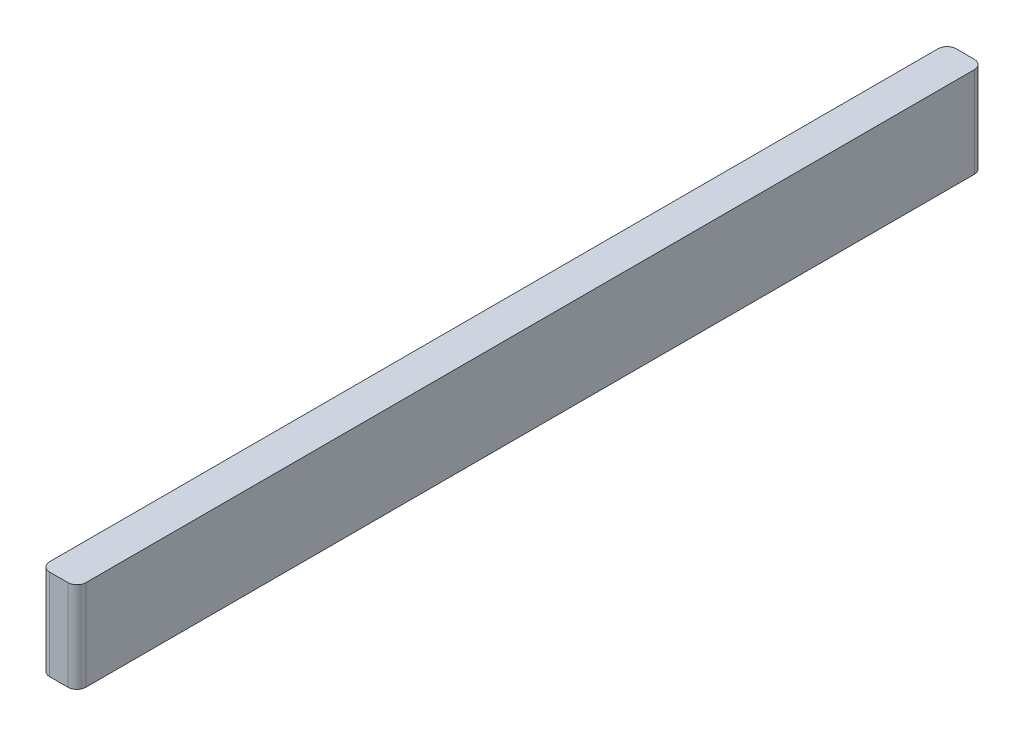
ISO-10303-21;
HEADER;
FILE_DESCRIPTION(('STEP AP214'),'2;1');
FILE_NAME('part.step','',(''),(''),'','','');
FILE_SCHEMA(('AUTOMOTIVE_DESIGN { 1 0 10303 214 1 1 1 1 }'));
ENDSEC;
DATA;
#1=APPLICATION_CONTEXT('core data for automotive mechanical design processes');
#2=APPLICATION_PROTOCOL_DEFINITION('international standard','automotive_design',2000,#1);
#3=PRODUCT_CONTEXT('',#1,'mechanical');
#4=PRODUCT('Part','Part','',(#3));
#5=PRODUCT_RELATED_PRODUCT_CATEGORY('part','',(#4));
#6=PRODUCT_DEFINITION_FORMATION('','',#4);
#7=PRODUCT_DEFINITION_CONTEXT('part definition',#1,'design');
#8=PRODUCT_DEFINITION('design','',#6,#7);
#9=PRODUCT_DEFINITION_SHAPE('','',#8);
#10=(LENGTH_UNIT() NAMED_UNIT(*) SI_UNIT(.MILLI.,.METRE.));
#11=(NAMED_UNIT(*) PLANE_ANGLE_UNIT() SI_UNIT($,.RADIAN.));
#12=(NAMED_UNIT(*) SI_UNIT($,.STERADIAN.) SOLID_ANGLE_UNIT());
#13=UNCERTAINTY_MEASURE_WITH_UNIT(LENGTH_MEASURE(1.E-05),#10,'distance_accuracy_value','');
#14=(GEOMETRIC_REPRESENTATION_CONTEXT(3) GLOBAL_UNCERTAINTY_ASSIGNED_CONTEXT((#13)) GLOBAL_UNIT_ASSIGNED_CONTEXT((#10,
#11,#12)) REPRESENTATION_CONTEXT('',''));
#15=CARTESIAN_POINT('',(0.,0.,0.));
#16=DIRECTION('',(0.,0.,1.));
#17=DIRECTION('',(1.,0.,0.));
#18=AXIS2_PLACEMENT_3D('',#15,#16,#17);
#19=CARTESIAN_POINT('',(-0.505,1.200399840128,0.25));
#20=DIRECTION('',(0.,0.,-1.));
#21=DIRECTION('',(-1.,0.,0.));
#22=AXIS2_PLACEMENT_3D('',#19,#20,#21);
#23=PLANE('',#22);
#24=DIRECTION('',(0.,-1.,0.));
#25=VECTOR('',#24,1.);
#26=CARTESIAN_POINT('',(-0.505,1.200399840128,0.25));
#27=LINE('',#26,#25);
#28=CARTESIAN_POINT('',(-0.505,0.65,0.25));
#29=VERTEX_POINT('',#28);
#30=CARTESIAN_POINT('',(-0.505,0.7,0.25));
#31=VERTEX_POINT('',#30);
#32=EDGE_CURVE('E94',#29,#31,#27,.F.);
#33=ORIENTED_EDGE('',*,*,#32,.F.);
#34=DIRECTION('',(1.,0.,0.));
#35=VECTOR('',#34,1.);
#36=CARTESIAN_POINT('',(-0.495,0.65,0.25));
#37=LINE('',#36,#35);
#38=CARTESIAN_POINT('',(-0.495,0.65,0.25));
#39=VERTEX_POINT('',#38);
#40=EDGE_CURVE('E125',#29,#39,#37,.T.);
#41=ORIENTED_EDGE('',*,*,#40,.T.);
#42=DIRECTION('',(0.,-1.,0.));
#43=VECTOR('',#42,1.);
#44=CARTESIAN_POINT('',(-0.495,1.200399840128,0.25));
#45=LINE('',#44,#43);
#46=CARTESIAN_POINT('',(-0.495,0.7,0.25));
#47=VERTEX_POINT('',#46);
#48=EDGE_CURVE('E110',#47,#39,#45,.T.);
#49=ORIENTED_EDGE('',*,*,#48,.F.);
#50=DIRECTION('',(1.,0.,0.));
#51=VECTOR('',#50,1.);
#52=CARTESIAN_POINT('',(0.,0.7,0.25));
#53=LINE('',#52,#51);
#54=EDGE_CURVE('E87',#31,#47,#53,.T.);
#55=ORIENTED_EDGE('',*,*,#54,.F.);
#56=EDGE_LOOP('',(#33,#41,#49,#55));
#57=FACE_BOUND('',#56,.T.);
#58=ADVANCED_FACE('F17',(#57),#23,.F.);
#59=CARTESIAN_POINT('',(-0.495,1.200399840128,-0.25));
#60=DIRECTION('',(0.,0.,1.));
#61=DIRECTION('',(1.,0.,0.));
#62=AXIS2_PLACEMENT_3D('',#59,#60,#61);
#63=PLANE('',#62);
#64=DIRECTION('',(0.,-1.,0.));
#65=VECTOR('',#64,1.);
#66=CARTESIAN_POINT('',(-0.495,1.200399840128,-0.25));
#67=LINE('',#66,#65);
#68=CARTESIAN_POINT('',(-0.495,0.65,-0.25));
#69=VERTEX_POINT('',#68);
#70=CARTESIAN_POINT('',(-0.495,0.7,-0.25));
#71=VERTEX_POINT('',#70);
#72=EDGE_CURVE('E82',#69,#71,#67,.F.);
#73=ORIENTED_EDGE('',*,*,#72,.F.);
#74=DIRECTION('',(1.,0.,0.));
#75=VECTOR('',#74,1.);
#76=CARTESIAN_POINT('',(-0.495,0.65,-0.25));
#77=LINE('',#76,#75);
#78=CARTESIAN_POINT('',(-0.505,0.65,-0.25));
#79=VERTEX_POINT('',#78);
#80=EDGE_CURVE('E131',#69,#79,#77,.F.);
#81=ORIENTED_EDGE('',*,*,#80,.T.);
#82=DIRECTION('',(0.,-1.,0.));
#83=VECTOR('',#82,1.);
#84=CARTESIAN_POINT('',(-0.505,1.200399840128,-0.25));
#85=LINE('',#84,#83);
#86=CARTESIAN_POINT('',(-0.505,0.7,-0.25));
#87=VERTEX_POINT('',#86);
#88=EDGE_CURVE('E138',#87,#79,#85,.T.);
#89=ORIENTED_EDGE('',*,*,#88,.F.);
#90=DIRECTION('',(1.,0.,0.));
#91=VECTOR('',#90,1.);
#92=CARTESIAN_POINT('',(0.,0.7,-0.25));
#93=LINE('',#92,#91);
#94=EDGE_CURVE('E118',#71,#87,#93,.F.);
#95=ORIENTED_EDGE('',*,*,#94,.F.);
#96=EDGE_LOOP('',(#73,#81,#89,#95));
#97=FACE_BOUND('',#96,.T.);
#98=ADVANCED_FACE('F154',(#97),#63,.F.);
#99=CARTESIAN_POINT('',(-0.505,1.200399840128,-0.245));
#100=DIRECTION('',(0.,-1.,0.));
#101=DIRECTION('',(0.,0.,-1.));
#102=AXIS2_PLACEMENT_3D('',#99,#100,#101);
#103=CYLINDRICAL_SURFACE('',#102,0.005);
#104=CARTESIAN_POINT('',(-0.505,0.65,-0.245));
#105=DIRECTION('',(0.,-1.,0.));
#106=DIRECTION('',(0.,0.,-1.));
#107=AXIS2_PLACEMENT_3D('',#104,#105,#106);
#108=CIRCLE('',#107,0.005);
#109=CARTESIAN_POINT('',(-0.51,0.65,-0.245));
#110=VERTEX_POINT('',#109);
#111=EDGE_CURVE('E130',#79,#110,#108,.F.);
#112=ORIENTED_EDGE('',*,*,#111,.T.);
#113=DIRECTION('',(0.,1.,0.));
#114=VECTOR('',#113,1.);
#115=CARTESIAN_POINT('',(-0.51,1.200399840128,-0.245));
#116=LINE('',#115,#114);
#117=CARTESIAN_POINT('',(-0.51,0.7,-0.245));
#118=VERTEX_POINT('',#117);
#119=EDGE_CURVE('E135',#110,#118,#116,.T.);
#120=ORIENTED_EDGE('',*,*,#119,.T.);
#121=CARTESIAN_POINT('',(-0.505,0.7,-0.245));
#122=DIRECTION('',(0.,-1.,0.));
#123=DIRECTION('',(0.,0.,-1.));
#124=AXIS2_PLACEMENT_3D('',#121,#122,#123);
#125=CIRCLE('',#124,0.005);
#126=EDGE_CURVE('E142',#87,#118,#125,.F.);
#127=ORIENTED_EDGE('',*,*,#126,.F.);
#128=ORIENTED_EDGE('',*,*,#88,.T.);
#129=EDGE_LOOP('',(#112,#120,#127,#128));
#130=FACE_BOUND('',#129,.T.);
#131=ADVANCED_FACE('F148',(#130),#103,.T.);
#132=CARTESIAN_POINT('',(-0.51,1.200399840128,-0.245));
#133=DIRECTION('',(1.,0.,0.));
#134=DIRECTION('',(0.,0.,-1.));
#135=AXIS2_PLACEMENT_3D('',#132,#133,#134);
#136=PLANE('',#135);
#137=ORIENTED_EDGE('',*,*,#119,.F.);
#138=DIRECTION('',(0.,0.,1.));
#139=VECTOR('',#138,1.);
#140=CARTESIAN_POINT('',(-0.51,0.65,0.245));
#141=LINE('',#140,#139);
#142=CARTESIAN_POINT('',(-0.51,0.65,0.245));
#143=VERTEX_POINT('',#142);
#144=EDGE_CURVE('E127',#110,#143,#141,.T.);
#145=ORIENTED_EDGE('',*,*,#144,.T.);
#146=DIRECTION('',(0.,-1.,0.));
#147=VECTOR('',#146,1.);
#148=CARTESIAN_POINT('',(-0.51,1.200399840128,0.245));
#149=LINE('',#148,#147);
#150=CARTESIAN_POINT('',(-0.51,0.7,0.245));
#151=VERTEX_POINT('',#150);
#152=EDGE_CURVE('E102',#151,#143,#149,.T.);
#153=ORIENTED_EDGE('',*,*,#152,.F.);
#154=DIRECTION('',(0.,0.,1.));
#155=VECTOR('',#154,1.);
#156=CARTESIAN_POINT('',(-0.51,0.7,0.));
#157=LINE('',#156,#155);
#158=EDGE_CURVE('E107',#118,#151,#157,.T.);
#159=ORIENTED_EDGE('',*,*,#158,.F.);
#160=EDGE_LOOP('',(#137,#145,#153,#159));
#161=FACE_BOUND('',#160,.T.);
#162=ADVANCED_FACE('F166',(#161),#136,.F.);
#163=CARTESIAN_POINT('',(-0.505,1.200399840128,0.245));
#164=DIRECTION('',(0.,-1.,0.));
#165=DIRECTION('',(0.,0.,-1.));
#166=AXIS2_PLACEMENT_3D('',#163,#164,#165);
#167=CYLINDRICAL_SURFACE('',#166,0.005);
#168=CARTESIAN_POINT('',(-0.505,0.65,0.245));
#169=DIRECTION('',(0.,-1.,0.));
#170=DIRECTION('',(0.,0.,-1.));
#171=AXIS2_PLACEMENT_3D('',#168,#169,#170);
#172=CIRCLE('',#171,0.005);
#173=EDGE_CURVE('E98',#143,#29,#172,.F.);
#174=ORIENTED_EDGE('',*,*,#173,.T.);
#175=ORIENTED_EDGE('',*,*,#32,.T.);
#176=CARTESIAN_POINT('',(-0.505,0.7,0.245));
#177=DIRECTION('',(0.,-1.,0.));
#178=DIRECTION('',(0.,0.,-1.));
#179=AXIS2_PLACEMENT_3D('',#176,#177,#178);
#180=CIRCLE('',#179,0.005);
#181=EDGE_CURVE('E96',#151,#31,#180,.F.);
#182=ORIENTED_EDGE('',*,*,#181,.F.);
#183=ORIENTED_EDGE('',*,*,#152,.T.);
#184=EDGE_LOOP('',(#174,#175,#182,#183));
#185=FACE_BOUND('',#184,.T.);
#186=ADVANCED_FACE('F95',(#185),#167,.T.);
#187=CARTESIAN_POINT('',(-0.495,1.200399840128,-0.245));
#188=DIRECTION('',(0.,-1.,0.));
#189=DIRECTION('',(0.,0.,-1.));
#190=AXIS2_PLACEMENT_3D('',#187,#188,#189);
#191=CYLINDRICAL_SURFACE('',#190,0.005);
#192=CARTESIAN_POINT('',(-0.495,0.65,-0.245));
#193=DIRECTION('',(0.,-1.,0.));
#194=DIRECTION('',(0.,0.,-1.));
#195=AXIS2_PLACEMENT_3D('',#192,#193,#194);
#196=CIRCLE('',#195,0.005);
#197=CARTESIAN_POINT('',(-0.49,0.65,-0.245));
#198=VERTEX_POINT('',#197);
#199=EDGE_CURVE('E20',#198,#69,#196,.F.);
#200=ORIENTED_EDGE('',*,*,#199,.T.);
#201=ORIENTED_EDGE('',*,*,#72,.T.);
#202=CARTESIAN_POINT('',(-0.495,0.7,-0.245));
#203=DIRECTION('',(0.,-1.,0.));
#204=DIRECTION('',(0.,0.,-1.));
#205=AXIS2_PLACEMENT_3D('',#202,#203,#204);
#206=CIRCLE('',#205,0.005);
#207=CARTESIAN_POINT('',(-0.49,0.7,-0.245));
#208=VERTEX_POINT('',#207);
#209=EDGE_CURVE('E113',#208,#71,#206,.F.);
#210=ORIENTED_EDGE('',*,*,#209,.F.);
#211=DIRECTION('',(0.,1.,0.));
#212=VECTOR('',#211,1.);
#213=CARTESIAN_POINT('',(-0.49,1.200399840128,-0.245));
#214=LINE('',#213,#212);
#215=EDGE_CURVE('E70',#208,#198,#214,.F.);
#216=ORIENTED_EDGE('',*,*,#215,.T.);
#217=EDGE_LOOP('',(#200,#201,#210,#216));
#218=FACE_BOUND('',#217,.T.);
#219=ADVANCED_FACE('F156',(#218),#191,.T.);
#220=CARTESIAN_POINT('',(-0.495,0.65,0.245));
#221=DIRECTION('',(0.,1.,0.));
#222=DIRECTION('',(0.,0.,1.));
#223=AXIS2_PLACEMENT_3D('',#220,#221,#222);
#224=PLANE('',#223);
#225=ORIENTED_EDGE('',*,*,#40,.F.);
#226=ORIENTED_EDGE('',*,*,#173,.F.);
#227=ORIENTED_EDGE('',*,*,#144,.F.);
#228=ORIENTED_EDGE('',*,*,#111,.F.);
#229=ORIENTED_EDGE('',*,*,#80,.F.);
#230=ORIENTED_EDGE('',*,*,#199,.F.);
#231=DIRECTION('',(0.,0.,1.));
#232=VECTOR('',#231,1.);
#233=CARTESIAN_POINT('',(-0.49,0.65,0.245));
#234=LINE('',#233,#232);
#235=CARTESIAN_POINT('',(-0.49,0.65,0.245));
#236=VERTEX_POINT('',#235);
#237=EDGE_CURVE('E121',#198,#236,#234,.T.);
#238=ORIENTED_EDGE('',*,*,#237,.T.);
#239=CARTESIAN_POINT('',(-0.495,0.65,0.245));
#240=DIRECTION('',(0.,-1.,0.));
#241=DIRECTION('',(0.,0.,-1.));
#242=AXIS2_PLACEMENT_3D('',#239,#240,#241);
#243=CIRCLE('',#242,0.005);
#244=EDGE_CURVE('E111',#39,#236,#243,.F.);
#245=ORIENTED_EDGE('',*,*,#244,.F.);
#246=EDGE_LOOP('',(#225,#226,#227,#228,#229,#230,#238,#245));
#247=FACE_BOUND('',#246,.T.);
#248=ADVANCED_FACE('F152',(#247),#224,.F.);
#249=CARTESIAN_POINT('',(-0.495,1.200399840128,0.245));
#250=DIRECTION('',(0.,-1.,0.));
#251=DIRECTION('',(0.,0.,-1.));
#252=AXIS2_PLACEMENT_3D('',#249,#250,#251);
#253=CYLINDRICAL_SURFACE('',#252,0.005);
#254=ORIENTED_EDGE('',*,*,#244,.T.);
#255=DIRECTION('',(0.,1.,0.));
#256=VECTOR('',#255,1.);
#257=CARTESIAN_POINT('',(-0.49,1.200399840128,0.245));
#258=LINE('',#257,#256);
#259=CARTESIAN_POINT('',(-0.49,0.7,0.245));
#260=VERTEX_POINT('',#259);
#261=EDGE_CURVE('E26',#236,#260,#258,.T.);
#262=ORIENTED_EDGE('',*,*,#261,.T.);
#263=CARTESIAN_POINT('',(-0.495,0.7,0.245));
#264=DIRECTION('',(0.,-1.,0.));
#265=DIRECTION('',(0.,0.,-1.));
#266=AXIS2_PLACEMENT_3D('',#263,#264,#265);
#267=CIRCLE('',#266,0.005);
#268=EDGE_CURVE('E34',#47,#260,#267,.F.);
#269=ORIENTED_EDGE('',*,*,#268,.F.);
#270=ORIENTED_EDGE('',*,*,#48,.T.);
#271=EDGE_LOOP('',(#254,#262,#269,#270));
#272=FACE_BOUND('',#271,.T.);
#273=ADVANCED_FACE('F164',(#272),#253,.T.);
#274=CARTESIAN_POINT('',(0.,0.7,0.));
#275=DIRECTION('',(0.,1.,0.));
#276=DIRECTION('',(0.,0.,1.));
#277=AXIS2_PLACEMENT_3D('',#274,#275,#276);
#278=PLANE('',#277);
#279=ORIENTED_EDGE('',*,*,#158,.T.);
#280=ORIENTED_EDGE('',*,*,#181,.T.);
#281=ORIENTED_EDGE('',*,*,#54,.T.);
#282=ORIENTED_EDGE('',*,*,#268,.T.);
#283=DIRECTION('',(0.,0.,1.));
#284=VECTOR('',#283,1.);
#285=CARTESIAN_POINT('',(-0.49,0.7,0.245));
#286=LINE('',#285,#284);
#287=EDGE_CURVE('E11',#260,#208,#286,.F.);
#288=ORIENTED_EDGE('',*,*,#287,.T.);
#289=ORIENTED_EDGE('',*,*,#209,.T.);
#290=ORIENTED_EDGE('',*,*,#94,.T.);
#291=ORIENTED_EDGE('',*,*,#126,.T.);
#292=EDGE_LOOP('',(#279,#280,#281,#282,#288,#289,#290,#291));
#293=FACE_BOUND('',#292,.T.);
#294=ADVANCED_FACE('F104',(#293),#278,.T.);
#295=CARTESIAN_POINT('',(-0.49,1.200399840128,0.245));
#296=DIRECTION('',(-1.,0.,0.));
#297=DIRECTION('',(0.,0.,1.));
#298=AXIS2_PLACEMENT_3D('',#295,#296,#297);
#299=PLANE('',#298);
#300=ORIENTED_EDGE('',*,*,#261,.F.);
#301=ORIENTED_EDGE('',*,*,#237,.F.);
#302=ORIENTED_EDGE('',*,*,#215,.F.);
#303=ORIENTED_EDGE('',*,*,#287,.F.);
#304=EDGE_LOOP('',(#300,#301,#302,#303));
#305=FACE_BOUND('',#304,.T.);
#306=ADVANCED_FACE('F168',(#305),#299,.F.);
#307=CLOSED_SHELL('',(#58,#98,#131,#162,#186,#219,#248,#273,#294,#306));
#308=MANIFOLD_SOLID_BREP('B1',#307);
#309=ADVANCED_BREP_SHAPE_REPRESENTATION('',(#18,#308),#14);
#310=SHAPE_DEFINITION_REPRESENTATION(#9,#309);
ENDSEC;
END-ISO-10303-21;
